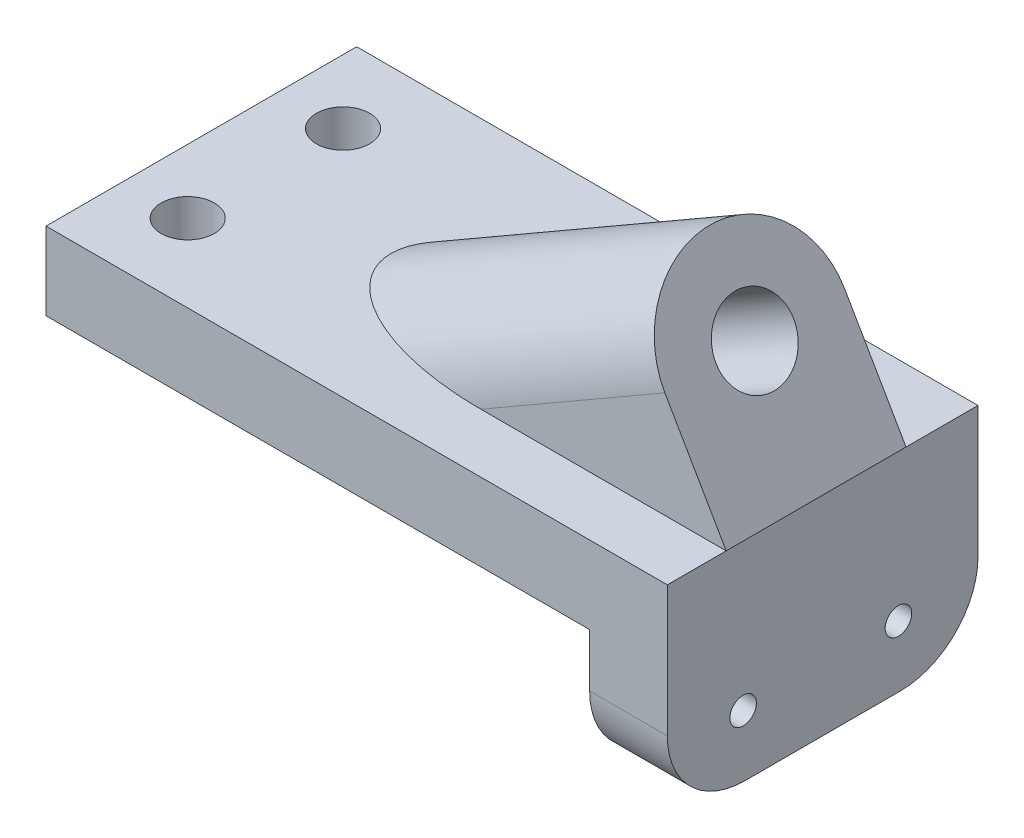
ISO-10303-21;
HEADER;
FILE_DESCRIPTION(('STEP AP214'),'2;1');
FILE_NAME('part.step','',(''),(''),'','','');
FILE_SCHEMA(('AUTOMOTIVE_DESIGN { 1 0 10303 214 1 1 1 1 }'));
ENDSEC;
DATA;
#1=APPLICATION_CONTEXT('core data for automotive mechanical design processes');
#2=APPLICATION_PROTOCOL_DEFINITION('international standard','automotive_design',2000,#1);
#3=PRODUCT_CONTEXT('',#1,'mechanical');
#4=PRODUCT('Part','Part','',(#3));
#5=PRODUCT_RELATED_PRODUCT_CATEGORY('part','',(#4));
#6=PRODUCT_DEFINITION_FORMATION('','',#4);
#7=PRODUCT_DEFINITION_CONTEXT('part definition',#1,'design');
#8=PRODUCT_DEFINITION('design','',#6,#7);
#9=PRODUCT_DEFINITION_SHAPE('','',#8);
#10=(LENGTH_UNIT() NAMED_UNIT(*) SI_UNIT(.MILLI.,.METRE.));
#11=(NAMED_UNIT(*) PLANE_ANGLE_UNIT() SI_UNIT($,.RADIAN.));
#12=(NAMED_UNIT(*) SI_UNIT($,.STERADIAN.) SOLID_ANGLE_UNIT());
#13=UNCERTAINTY_MEASURE_WITH_UNIT(LENGTH_MEASURE(1.E-05),#10,'distance_accuracy_value','');
#14=(GEOMETRIC_REPRESENTATION_CONTEXT(3) GLOBAL_UNCERTAINTY_ASSIGNED_CONTEXT((#13)) GLOBAL_UNIT_ASSIGNED_CONTEXT((#10,
#11,#12)) REPRESENTATION_CONTEXT('',''));
#15=CARTESIAN_POINT('',(0.,0.,0.));
#16=DIRECTION('',(0.,0.,1.));
#17=DIRECTION('',(1.,0.,0.));
#18=AXIS2_PLACEMENT_3D('',#15,#16,#17);
#19=CARTESIAN_POINT('',(0.,-19.,76.));
#20=DIRECTION('',(-1.,0.,0.));
#21=DIRECTION('',(0.,0.,1.));
#22=AXIS2_PLACEMENT_3D('',#19,#20,#21);
#23=PLANE('',#22);
#24=DIRECTION('',(0.,1.,0.));
#25=VECTOR('',#24,1.);
#26=CARTESIAN_POINT('',(0.,-19.,0.));
#27=LINE('',#26,#25);
#28=CARTESIAN_POINT('',(0.,-19.,0.));
#29=VERTEX_POINT('',#28);
#30=CARTESIAN_POINT('',(0.,0.,0.));
#31=VERTEX_POINT('',#30);
#32=EDGE_CURVE('E193',#29,#31,#27,.T.);
#33=ORIENTED_EDGE('',*,*,#32,.F.);
#34=DIRECTION('',(0.,0.,-1.));
#35=VECTOR('',#34,1.);
#36=CARTESIAN_POINT('',(0.,-19.,76.));
#37=LINE('',#36,#35);
#38=CARTESIAN_POINT('',(0.,-19.,76.));
#39=VERTEX_POINT('',#38);
#40=EDGE_CURVE('E172',#39,#29,#37,.T.);
#41=ORIENTED_EDGE('',*,*,#40,.F.);
#42=DIRECTION('',(0.,1.,0.));
#43=VECTOR('',#42,1.);
#44=CARTESIAN_POINT('',(0.,-19.,76.));
#45=LINE('',#44,#43);
#46=CARTESIAN_POINT('',(0.,0.,76.));
#47=VERTEX_POINT('',#46);
#48=EDGE_CURVE('E173',#39,#47,#45,.T.);
#49=ORIENTED_EDGE('',*,*,#48,.T.);
#50=DIRECTION('',(0.,0.,-1.));
#51=VECTOR('',#50,1.);
#52=CARTESIAN_POINT('',(0.,0.,76.));
#53=LINE('',#52,#51);
#54=EDGE_CURVE('E192',#47,#31,#53,.T.);
#55=ORIENTED_EDGE('',*,*,#54,.T.);
#56=EDGE_LOOP('',(#33,#41,#49,#55));
#57=FACE_BOUND('',#56,.T.);
#58=ADVANCED_FACE('F39',(#57),#23,.T.);
#59=CARTESIAN_POINT('',(133.,-19.,76.));
#60=DIRECTION('',(0.,-1.,0.));
#61=DIRECTION('',(1.,0.,0.));
#62=AXIS2_PLACEMENT_3D('',#59,#60,#61);
#63=PLANE('',#62);
#64=CARTESIAN_POINT('',(15.6653202113634,-19.,57.));
#65=DIRECTION('',(0.,-1.,0.));
#66=DIRECTION('',(1.,0.,0.));
#67=AXIS2_PLACEMENT_3D('',#64,#65,#66);
#68=CIRCLE('',#67,6.5);
#69=CARTESIAN_POINT('',(22.1653202113634,-19.,57.));
#70=VERTEX_POINT('',#69);
#71=EDGE_CURVE('E299',#70,#70,#68,.T.);
#72=ORIENTED_EDGE('',*,*,#71,.F.);
#73=EDGE_LOOP('',(#72));
#74=FACE_BOUND('',#73,.T.);
#75=CARTESIAN_POINT('',(15.6653202113634,-19.,19.));
#76=DIRECTION('',(0.,-1.,0.));
#77=DIRECTION('',(1.,0.,0.));
#78=AXIS2_PLACEMENT_3D('',#75,#76,#77);
#79=CIRCLE('',#78,6.5);
#80=CARTESIAN_POINT('',(22.1653202113634,-19.,19.));
#81=VERTEX_POINT('',#80);
#82=EDGE_CURVE('E306',#81,#81,#79,.T.);
#83=ORIENTED_EDGE('',*,*,#82,.F.);
#84=EDGE_LOOP('',(#83));
#85=FACE_BOUND('',#84,.T.);
#86=DIRECTION('',(-1.,0.,0.));
#87=VECTOR('',#86,1.);
#88=CARTESIAN_POINT('',(133.,-19.,0.));
#89=LINE('',#88,#87);
#90=CARTESIAN_POINT('',(133.,-19.,0.));
#91=VERTEX_POINT('',#90);
#92=EDGE_CURVE('E178',#91,#29,#89,.T.);
#93=ORIENTED_EDGE('',*,*,#92,.F.);
#94=DIRECTION('',(0.,0.,-1.));
#95=VECTOR('',#94,1.);
#96=CARTESIAN_POINT('',(133.,-19.,76.));
#97=LINE('',#96,#95);
#98=CARTESIAN_POINT('',(133.,-19.,76.));
#99=VERTEX_POINT('',#98);
#100=EDGE_CURVE('E213',#99,#91,#97,.T.);
#101=ORIENTED_EDGE('',*,*,#100,.F.);
#102=DIRECTION('',(-1.,0.,0.));
#103=VECTOR('',#102,1.);
#104=CARTESIAN_POINT('',(133.,-19.,76.));
#105=LINE('',#104,#103);
#106=EDGE_CURVE('E188',#99,#39,#105,.T.);
#107=ORIENTED_EDGE('',*,*,#106,.T.);
#108=ORIENTED_EDGE('',*,*,#40,.T.);
#109=EDGE_LOOP('',(#93,#101,#107,#108));
#110=FACE_BOUND('',#109,.T.);
#111=ADVANCED_FACE('F274',(#74,#85,#110),#63,.T.);
#112=CARTESIAN_POINT('',(133.,-51.,76.));
#113=DIRECTION('',(-1.,0.,0.));
#114=DIRECTION('',(0.,0.,1.));
#115=AXIS2_PLACEMENT_3D('',#112,#113,#114);
#116=PLANE('',#115);
#117=CARTESIAN_POINT('',(133.,-35.9135856078218,57.4589917201845));
#118=DIRECTION('',(-1.,0.,0.));
#119=DIRECTION('',(0.,0.,1.));
#120=AXIS2_PLACEMENT_3D('',#117,#118,#119);
#121=CIRCLE('',#120,3.25);
#122=CARTESIAN_POINT('',(133.,-35.9135856078218,60.7089917201845));
#123=VERTEX_POINT('',#122);
#124=EDGE_CURVE('E156',#123,#123,#121,.T.);
#125=ORIENTED_EDGE('',*,*,#124,.F.);
#126=EDGE_LOOP('',(#125));
#127=FACE_BOUND('',#126,.T.);
#128=CARTESIAN_POINT('',(133.,-35.9135856078218,19.4589917201845));
#129=DIRECTION('',(-1.,0.,0.));
#130=DIRECTION('',(0.,0.,1.));
#131=AXIS2_PLACEMENT_3D('',#128,#129,#130);
#132=CIRCLE('',#131,3.25);
#133=CARTESIAN_POINT('',(133.,-35.9135856078218,22.7089917201845));
#134=VERTEX_POINT('',#133);
#135=EDGE_CURVE('E290',#134,#134,#132,.T.);
#136=ORIENTED_EDGE('',*,*,#135,.F.);
#137=EDGE_LOOP('',(#136));
#138=FACE_BOUND('',#137,.T.);
#139=DIRECTION('',(0.,1.,0.));
#140=VECTOR('',#139,1.);
#141=CARTESIAN_POINT('',(133.,-51.,0.));
#142=LINE('',#141,#140);
#143=CARTESIAN_POINT('',(133.,-32.,0.));
#144=VERTEX_POINT('',#143);
#145=EDGE_CURVE('E205',#144,#91,#142,.T.);
#146=ORIENTED_EDGE('',*,*,#145,.F.);
#147=CARTESIAN_POINT('',(133.,-32.,19.));
#148=DIRECTION('',(-1.,0.,0.));
#149=DIRECTION('',(0.,0.,1.));
#150=AXIS2_PLACEMENT_3D('',#147,#148,#149);
#151=CIRCLE('',#150,19.);
#152=CARTESIAN_POINT('',(133.,-51.,19.));
#153=VERTEX_POINT('',#152);
#154=EDGE_CURVE('E236',#144,#153,#151,.T.);
#155=ORIENTED_EDGE('',*,*,#154,.T.);
#156=DIRECTION('',(0.,0.,-1.));
#157=VECTOR('',#156,1.);
#158=CARTESIAN_POINT('',(133.,-51.,76.));
#159=LINE('',#158,#157);
#160=CARTESIAN_POINT('',(133.,-51.,57.));
#161=VERTEX_POINT('',#160);
#162=EDGE_CURVE('E217',#161,#153,#159,.T.);
#163=ORIENTED_EDGE('',*,*,#162,.F.);
#164=CARTESIAN_POINT('',(133.,-32.,57.));
#165=DIRECTION('',(-1.,0.,0.));
#166=DIRECTION('',(0.,0.,1.));
#167=AXIS2_PLACEMENT_3D('',#164,#165,#166);
#168=CIRCLE('',#167,19.);
#169=CARTESIAN_POINT('',(133.,-32.,76.));
#170=VERTEX_POINT('',#169);
#171=EDGE_CURVE('E233',#161,#170,#168,.T.);
#172=ORIENTED_EDGE('',*,*,#171,.T.);
#173=DIRECTION('',(0.,1.,0.));
#174=VECTOR('',#173,1.);
#175=CARTESIAN_POINT('',(133.,-51.,76.));
#176=LINE('',#175,#174);
#177=EDGE_CURVE('E185',#170,#99,#176,.T.);
#178=ORIENTED_EDGE('',*,*,#177,.T.);
#179=ORIENTED_EDGE('',*,*,#100,.T.);
#180=EDGE_LOOP('',(#146,#155,#163,#172,#178,#179));
#181=FACE_BOUND('',#180,.T.);
#182=ADVANCED_FACE('F262',(#127,#138,#181),#116,.T.);
#183=CARTESIAN_POINT('',(152.,-51.,76.));
#184=DIRECTION('',(0.,-1.,0.));
#185=DIRECTION('',(1.,0.,0.));
#186=AXIS2_PLACEMENT_3D('',#183,#184,#185);
#187=PLANE('',#186);
#188=ORIENTED_EDGE('',*,*,#162,.T.);
#189=DIRECTION('',(-1.,0.,0.));
#190=VECTOR('',#189,1.);
#191=CARTESIAN_POINT('',(152.,-51.,19.));
#192=LINE('',#191,#190);
#193=CARTESIAN_POINT('',(152.,-51.,19.));
#194=VERTEX_POINT('',#193);
#195=EDGE_CURVE('E61',#153,#194,#192,.F.);
#196=ORIENTED_EDGE('',*,*,#195,.T.);
#197=DIRECTION('',(0.,0.,-1.));
#198=VECTOR('',#197,1.);
#199=CARTESIAN_POINT('',(152.,-51.,76.));
#200=LINE('',#199,#198);
#201=CARTESIAN_POINT('',(152.,-51.,57.));
#202=VERTEX_POINT('',#201);
#203=EDGE_CURVE('E220',#202,#194,#200,.T.);
#204=ORIENTED_EDGE('',*,*,#203,.F.);
#205=DIRECTION('',(-1.,0.,0.));
#206=VECTOR('',#205,1.);
#207=CARTESIAN_POINT('',(133.,-51.,57.));
#208=LINE('',#207,#206);
#209=EDGE_CURVE('E239',#202,#161,#208,.T.);
#210=ORIENTED_EDGE('',*,*,#209,.T.);
#211=EDGE_LOOP('',(#188,#196,#204,#210));
#212=FACE_BOUND('',#211,.T.);
#213=ADVANCED_FACE('F263',(#212),#187,.T.);
#214=CARTESIAN_POINT('',(152.,0.,76.));
#215=DIRECTION('',(1.,0.,0.));
#216=DIRECTION('',(0.,0.,-1.));
#217=AXIS2_PLACEMENT_3D('',#214,#215,#216);
#218=PLANE('',#217);
#219=CARTESIAN_POINT('',(152.,-35.9135856078218,57.4589917201845));
#220=DIRECTION('',(1.,0.,0.));
#221=DIRECTION('',(0.,0.,-1.));
#222=AXIS2_PLACEMENT_3D('',#219,#220,#221);
#223=CIRCLE('',#222,3.25);
#224=CARTESIAN_POINT('',(152.,-35.9135856078218,54.2089917201845));
#225=VERTEX_POINT('',#224);
#226=EDGE_CURVE('E294',#225,#225,#223,.T.);
#227=ORIENTED_EDGE('',*,*,#226,.F.);
#228=EDGE_LOOP('',(#227));
#229=FACE_BOUND('',#228,.T.);
#230=CARTESIAN_POINT('',(152.,-35.9135856078218,19.4589917201845));
#231=DIRECTION('',(1.,0.,0.));
#232=DIRECTION('',(0.,0.,-1.));
#233=AXIS2_PLACEMENT_3D('',#230,#231,#232);
#234=CIRCLE('',#233,3.25);
#235=CARTESIAN_POINT('',(152.,-35.9135856078218,16.2089917201845));
#236=VERTEX_POINT('',#235);
#237=EDGE_CURVE('E295',#236,#236,#234,.T.);
#238=ORIENTED_EDGE('',*,*,#237,.F.);
#239=EDGE_LOOP('',(#238));
#240=FACE_BOUND('',#239,.T.);
#241=ORIENTED_EDGE('',*,*,#203,.T.);
#242=CARTESIAN_POINT('',(152.,-32.,19.));
#243=DIRECTION('',(1.,0.,0.));
#244=DIRECTION('',(0.,0.,-1.));
#245=AXIS2_PLACEMENT_3D('',#242,#243,#244);
#246=CIRCLE('',#245,19.);
#247=CARTESIAN_POINT('',(152.,-32.,0.));
#248=VERTEX_POINT('',#247);
#249=EDGE_CURVE('E48',#194,#248,#246,.T.);
#250=ORIENTED_EDGE('',*,*,#249,.T.);
#251=DIRECTION('',(0.,-1.,0.));
#252=VECTOR('',#251,1.);
#253=CARTESIAN_POINT('',(152.,0.,0.));
#254=LINE('',#253,#252);
#255=CARTESIAN_POINT('',(152.,0.,0.));
#256=VERTEX_POINT('',#255);
#257=EDGE_CURVE('E201',#256,#248,#254,.T.);
#258=ORIENTED_EDGE('',*,*,#257,.F.);
#259=DIRECTION('',(0.,0.,-1.));
#260=VECTOR('',#259,1.);
#261=CARTESIAN_POINT('',(152.,0.,76.));
#262=LINE('',#261,#260);
#263=CARTESIAN_POINT('',(152.,0.,17.6043918931693));
#264=VERTEX_POINT('',#263);
#265=EDGE_CURVE('E227',#264,#256,#262,.T.);
#266=ORIENTED_EDGE('',*,*,#265,.F.);
#267=DIRECTION('',(0.,0.,-1.));
#268=VECTOR('',#267,1.);
#269=CARTESIAN_POINT('',(152.,0.,61.6043918931693));
#270=LINE('',#269,#268);
#271=CARTESIAN_POINT('',(152.,0.,61.6043918931693));
#272=VERTEX_POINT('',#271);
#273=EDGE_CURVE('E148',#272,#264,#270,.T.);
#274=ORIENTED_EDGE('',*,*,#273,.F.);
#275=CARTESIAN_POINT('',(152.,0.,76.));
#276=VERTEX_POINT('',#275);
#277=EDGE_CURVE('E223',#276,#272,#262,.T.);
#278=ORIENTED_EDGE('',*,*,#277,.F.);
#279=DIRECTION('',(0.,-1.,0.));
#280=VECTOR('',#279,1.);
#281=CARTESIAN_POINT('',(152.,0.,76.));
#282=LINE('',#281,#280);
#283=CARTESIAN_POINT('',(152.,-32.,76.));
#284=VERTEX_POINT('',#283);
#285=EDGE_CURVE('E182',#276,#284,#282,.T.);
#286=ORIENTED_EDGE('',*,*,#285,.T.);
#287=CARTESIAN_POINT('',(152.,-32.,57.));
#288=DIRECTION('',(1.,0.,0.));
#289=DIRECTION('',(0.,0.,-1.));
#290=AXIS2_PLACEMENT_3D('',#287,#288,#289);
#291=CIRCLE('',#290,19.);
#292=EDGE_CURVE('E245',#284,#202,#291,.T.);
#293=ORIENTED_EDGE('',*,*,#292,.T.);
#294=EDGE_LOOP('',(#241,#250,#258,#266,#274,#278,#286,#293));
#295=FACE_BOUND('',#294,.T.);
#296=ADVANCED_FACE('F251',(#229,#240,#295),#218,.T.);
#297=CARTESIAN_POINT('',(0.,0.,76.));
#298=DIRECTION('',(0.,1.,0.));
#299=DIRECTION('',(0.,0.,1.));
#300=AXIS2_PLACEMENT_3D('',#297,#298,#299);
#301=PLANE('',#300);
#302=CARTESIAN_POINT('',(15.6653202113634,0.,57.));
#303=DIRECTION('',(0.,1.,0.));
#304=DIRECTION('',(0.,0.,1.));
#305=AXIS2_PLACEMENT_3D('',#302,#303,#304);
#306=CIRCLE('',#305,6.5);
#307=CARTESIAN_POINT('',(15.6653202113634,0.,63.5));
#308=VERTEX_POINT('',#307);
#309=EDGE_CURVE('E310',#308,#308,#306,.T.);
#310=ORIENTED_EDGE('',*,*,#309,.F.);
#311=EDGE_LOOP('',(#310));
#312=FACE_BOUND('',#311,.T.);
#313=CARTESIAN_POINT('',(15.6653202113634,0.,19.));
#314=DIRECTION('',(0.,1.,0.));
#315=DIRECTION('',(0.,0.,1.));
#316=AXIS2_PLACEMENT_3D('',#313,#314,#315);
#317=CIRCLE('',#316,6.5);
#318=CARTESIAN_POINT('',(15.6653202113634,0.,25.5));
#319=VERTEX_POINT('',#318);
#320=EDGE_CURVE('E311',#319,#319,#317,.T.);
#321=ORIENTED_EDGE('',*,*,#320,.F.);
#322=EDGE_LOOP('',(#321));
#323=FACE_BOUND('',#322,.T.);
#324=CARTESIAN_POINT('',(91.9999999999998,0.,39.6043918931693));
#325=DIRECTION('',(0.,1.,0.));
#326=DIRECTION('',(1.,0.,0.));
#327=AXIS2_PLACEMENT_3D('',#324,#325,#326);
#328=ELLIPSE('',#327,44.0000000000002,22.);
#329=CARTESIAN_POINT('',(91.9999999999998,0.,61.6043918931693));
#330=VERTEX_POINT('',#329);
#331=CARTESIAN_POINT('',(91.9999999999998,0.,17.6043918931693));
#332=VERTEX_POINT('',#331);
#333=EDGE_CURVE('E133',#330,#332,#328,.F.);
#334=ORIENTED_EDGE('',*,*,#333,.T.);
#335=DIRECTION('',(1.,0.,0.));
#336=VECTOR('',#335,1.);
#337=CARTESIAN_POINT('',(9.51271277748372,0.,17.6043918931693));
#338=LINE('',#337,#336);
#339=EDGE_CURVE('E165',#332,#264,#338,.T.);
#340=ORIENTED_EDGE('',*,*,#339,.T.);
#341=ORIENTED_EDGE('',*,*,#265,.T.);
#342=DIRECTION('',(1.,0.,0.));
#343=VECTOR('',#342,1.);
#344=CARTESIAN_POINT('',(0.,0.,0.));
#345=LINE('',#344,#343);
#346=EDGE_CURVE('E197',#31,#256,#345,.T.);
#347=ORIENTED_EDGE('',*,*,#346,.F.);
#348=ORIENTED_EDGE('',*,*,#54,.F.);
#349=DIRECTION('',(1.,0.,0.));
#350=VECTOR('',#349,1.);
#351=CARTESIAN_POINT('',(0.,0.,76.));
#352=LINE('',#351,#350);
#353=EDGE_CURVE('E177',#47,#276,#352,.T.);
#354=ORIENTED_EDGE('',*,*,#353,.T.);
#355=ORIENTED_EDGE('',*,*,#277,.T.);
#356=DIRECTION('',(-1.,0.,0.));
#357=VECTOR('',#356,1.);
#358=CARTESIAN_POINT('',(9.51271277748372,0.,61.6043918931693));
#359=LINE('',#358,#357);
#360=EDGE_CURVE('E143',#272,#330,#359,.T.);
#361=ORIENTED_EDGE('',*,*,#360,.T.);
#362=EDGE_LOOP('',(#334,#340,#341,#347,#348,#354,#355,#361));
#363=FACE_BOUND('',#362,.T.);
#364=ADVANCED_FACE('F278',(#312,#323,#363),#301,.T.);
#365=CARTESIAN_POINT('',(0.,0.,76.));
#366=DIRECTION('',(0.,0.,-1.));
#367=DIRECTION('',(-1.,0.,0.));
#368=AXIS2_PLACEMENT_3D('',#365,#366,#367);
#369=PLANE('',#368);
#370=ORIENTED_EDGE('',*,*,#177,.F.);
#371=DIRECTION('',(-1.,0.,0.));
#372=VECTOR('',#371,1.);
#373=CARTESIAN_POINT('',(152.,-32.,76.));
#374=LINE('',#373,#372);
#375=EDGE_CURVE('E11',#170,#284,#374,.F.);
#376=ORIENTED_EDGE('',*,*,#375,.T.);
#377=ORIENTED_EDGE('',*,*,#285,.F.);
#378=ORIENTED_EDGE('',*,*,#353,.F.);
#379=ORIENTED_EDGE('',*,*,#48,.F.);
#380=ORIENTED_EDGE('',*,*,#106,.F.);
#381=EDGE_LOOP('',(#370,#376,#377,#378,#379,#380));
#382=FACE_BOUND('',#381,.T.);
#383=ADVANCED_FACE('F269',(#382),#369,.F.);
#384=CARTESIAN_POINT('',(0.,0.,0.));
#385=DIRECTION('',(0.,0.,-1.));
#386=DIRECTION('',(-1.,0.,0.));
#387=AXIS2_PLACEMENT_3D('',#384,#385,#386);
#388=PLANE('',#387);
#389=ORIENTED_EDGE('',*,*,#257,.T.);
#390=DIRECTION('',(-1.,0.,0.));
#391=VECTOR('',#390,1.);
#392=CARTESIAN_POINT('',(0.,-31.9999999999999,0.));
#393=LINE('',#392,#391);
#394=EDGE_CURVE('E171',#248,#144,#393,.T.);
#395=ORIENTED_EDGE('',*,*,#394,.T.);
#396=ORIENTED_EDGE('',*,*,#145,.T.);
#397=ORIENTED_EDGE('',*,*,#92,.T.);
#398=ORIENTED_EDGE('',*,*,#32,.T.);
#399=ORIENTED_EDGE('',*,*,#346,.T.);
#400=EDGE_LOOP('',(#389,#395,#396,#397,#398,#399));
#401=FACE_BOUND('',#400,.T.);
#402=ADVANCED_FACE('F256',(#401),#388,.T.);
#403=CARTESIAN_POINT('',(9.51271277748372,-47.6240574826414,39.6043918931693));
#404=DIRECTION('',(0.86602540378444,0.499999999999998,0.));
#405=DIRECTION('',(-0.499999999999998,0.86602540378444,0.));
#406=AXIS2_PLACEMENT_3D('',#403,#404,#405);
#407=CYLINDRICAL_SURFACE('',#406,9.5);
#408=CARTESIAN_POINT('',(91.9999999999998,0.,39.6043918931693));
#409=DIRECTION('',(0.,1.,0.));
#410=DIRECTION('',(1.,0.,0.));
#411=AXIS2_PLACEMENT_3D('',#408,#409,#410);
#412=ELLIPSE('',#411,19.0000000000001,9.5);
#413=CARTESIAN_POINT('',(111.,0.,39.6043918931693));
#414=VERTEX_POINT('',#413);
#415=EDGE_CURVE('E167',#414,#414,#412,.F.);
#416=ORIENTED_EDGE('',*,*,#415,.T.);
#417=EDGE_LOOP('',(#416));
#418=FACE_BOUND('',#417,.T.);
#419=CARTESIAN_POINT('',(137.,25.9807621135332,39.6043918931693));
#420=DIRECTION('',(0.86602540378444,0.499999999999998,0.));
#421=DIRECTION('',(-0.499999999999998,0.86602540378444,0.));
#422=AXIS2_PLACEMENT_3D('',#419,#420,#421);
#423=CIRCLE('',#422,9.5);
#424=CARTESIAN_POINT('',(132.25,34.2080034494854,39.6043918931693));
#425=VERTEX_POINT('',#424);
#426=EDGE_CURVE('E152',#425,#425,#423,.T.);
#427=ORIENTED_EDGE('',*,*,#426,.T.);
#428=EDGE_LOOP('',(#427));
#429=FACE_BOUND('',#428,.T.);
#430=ADVANCED_FACE('F369',(#418,#429),#407,.F.);
#431=CARTESIAN_POINT('',(137.,25.9807621135332,39.6043918931693));
#432=DIRECTION('',(0.86602540378444,0.499999999999998,0.));
#433=DIRECTION('',(-0.499999999999998,0.86602540378444,0.));
#434=AXIS2_PLACEMENT_3D('',#431,#432,#433);
#435=PLANE('',#434);
#436=ORIENTED_EDGE('',*,*,#426,.F.);
#437=EDGE_LOOP('',(#436));
#438=FACE_BOUND('',#437,.T.);
#439=CARTESIAN_POINT('',(137.,25.9807621135332,39.6043918931693));
#440=DIRECTION('',(0.86602540378444,0.499999999999998,0.));
#441=DIRECTION('',(-0.499999999999998,0.86602540378444,0.));
#442=AXIS2_PLACEMENT_3D('',#439,#440,#441);
#443=CIRCLE('',#442,22.);
#444=CARTESIAN_POINT('',(137.,25.9807621135332,17.6043918931693));
#445=VERTEX_POINT('',#444);
#446=CARTESIAN_POINT('',(137.,25.9807621135332,61.6043918931693));
#447=VERTEX_POINT('',#446);
#448=EDGE_CURVE('E130',#445,#447,#443,.T.);
#449=ORIENTED_EDGE('',*,*,#448,.T.);
#450=DIRECTION('',(0.499999999999998,-0.86602540378444,0.));
#451=VECTOR('',#450,1.);
#452=CARTESIAN_POINT('',(137.,25.9807621135332,61.6043918931693));
#453=LINE('',#452,#451);
#454=EDGE_CURVE('E141',#447,#272,#453,.T.);
#455=ORIENTED_EDGE('',*,*,#454,.T.);
#456=ORIENTED_EDGE('',*,*,#273,.T.);
#457=DIRECTION('',(-0.499999999999998,0.86602540378444,0.));
#458=VECTOR('',#457,1.);
#459=CARTESIAN_POINT('',(137.,25.9807621135332,17.6043918931693));
#460=LINE('',#459,#458);
#461=EDGE_CURVE('E138',#264,#445,#460,.T.);
#462=ORIENTED_EDGE('',*,*,#461,.T.);
#463=EDGE_LOOP('',(#449,#455,#456,#462));
#464=FACE_BOUND('',#463,.T.);
#465=ADVANCED_FACE('F150',(#438,#464),#435,.T.);
#466=CARTESIAN_POINT('',(9.51271277748372,-47.6240574826414,61.6043918931693));
#467=DIRECTION('',(0.,0.,1.));
#468=DIRECTION('',(1.,0.,0.));
#469=AXIS2_PLACEMENT_3D('',#466,#467,#468);
#470=PLANE('',#469);
#471=ORIENTED_EDGE('',*,*,#360,.F.);
#472=ORIENTED_EDGE('',*,*,#454,.F.);
#473=DIRECTION('',(0.86602540378444,0.499999999999998,0.));
#474=VECTOR('',#473,1.);
#475=CARTESIAN_POINT('',(9.51271277748372,-47.6240574826414,61.6043918931693));
#476=LINE('',#475,#474);
#477=EDGE_CURVE('E125',#330,#447,#476,.T.);
#478=ORIENTED_EDGE('',*,*,#477,.F.);
#479=EDGE_LOOP('',(#471,#472,#478));
#480=FACE_BOUND('',#479,.T.);
#481=ADVANCED_FACE('F142',(#480),#470,.T.);
#482=CARTESIAN_POINT('',(9.51271277748372,-47.6240574826414,17.6043918931693));
#483=DIRECTION('',(0.,0.,-1.));
#484=DIRECTION('',(-1.,0.,0.));
#485=AXIS2_PLACEMENT_3D('',#482,#483,#484);
#486=PLANE('',#485);
#487=ORIENTED_EDGE('',*,*,#339,.F.);
#488=DIRECTION('',(0.86602540378444,0.499999999999998,0.));
#489=VECTOR('',#488,1.);
#490=CARTESIAN_POINT('',(9.51271277748372,-47.6240574826414,17.6043918931693));
#491=LINE('',#490,#489);
#492=EDGE_CURVE('E137',#332,#445,#491,.T.);
#493=ORIENTED_EDGE('',*,*,#492,.T.);
#494=ORIENTED_EDGE('',*,*,#461,.F.);
#495=EDGE_LOOP('',(#487,#493,#494));
#496=FACE_BOUND('',#495,.T.);
#497=ADVANCED_FACE('F458',(#496),#486,.T.);
#498=CARTESIAN_POINT('',(9.51271277748372,-47.6240574826414,39.6043918931693));
#499=DIRECTION('',(0.86602540378444,0.499999999999998,0.));
#500=DIRECTION('',(-0.499999999999998,0.86602540378444,0.));
#501=AXIS2_PLACEMENT_3D('',#498,#499,#500);
#502=CYLINDRICAL_SURFACE('',#501,22.);
#503=ORIENTED_EDGE('',*,*,#333,.F.);
#504=ORIENTED_EDGE('',*,*,#477,.T.);
#505=ORIENTED_EDGE('',*,*,#448,.F.);
#506=ORIENTED_EDGE('',*,*,#492,.F.);
#507=EDGE_LOOP('',(#503,#504,#505,#506));
#508=FACE_BOUND('',#507,.T.);
#509=ADVANCED_FACE('F127',(#508),#502,.T.);
#510=ORIENTED_EDGE('',*,*,#415,.F.);
#511=EDGE_LOOP('',(#510));
#512=FACE_BOUND('',#511,.T.);
#513=ADVANCED_FACE('F324',(#512),#301,.T.);
#514=CARTESIAN_POINT('',(76.,-35.9135856078218,19.4589917201845));
#515=DIRECTION('',(1.,0.,0.));
#516=DIRECTION('',(0.,0.,-1.));
#517=AXIS2_PLACEMENT_3D('',#514,#515,#516);
#518=CYLINDRICAL_SURFACE('',#517,3.25);
#519=ORIENTED_EDGE('',*,*,#135,.T.);
#520=EDGE_LOOP('',(#519));
#521=FACE_BOUND('',#520,.T.);
#522=ORIENTED_EDGE('',*,*,#237,.T.);
#523=EDGE_LOOP('',(#522));
#524=FACE_BOUND('',#523,.T.);
#525=ADVANCED_FACE('F338',(#521,#524),#518,.F.);
#526=CARTESIAN_POINT('',(76.,-35.9135856078218,57.4589917201845));
#527=DIRECTION('',(1.,0.,0.));
#528=DIRECTION('',(0.,0.,-1.));
#529=AXIS2_PLACEMENT_3D('',#526,#527,#528);
#530=CYLINDRICAL_SURFACE('',#529,3.25);
#531=ORIENTED_EDGE('',*,*,#124,.T.);
#532=EDGE_LOOP('',(#531));
#533=FACE_BOUND('',#532,.T.);
#534=ORIENTED_EDGE('',*,*,#226,.T.);
#535=EDGE_LOOP('',(#534));
#536=FACE_BOUND('',#535,.T.);
#537=ADVANCED_FACE('F329',(#533,#536),#530,.F.);
#538=CARTESIAN_POINT('',(15.6653202113634,-76.,19.));
#539=DIRECTION('',(0.,1.,0.));
#540=DIRECTION('',(0.,0.,1.));
#541=AXIS2_PLACEMENT_3D('',#538,#539,#540);
#542=CYLINDRICAL_SURFACE('',#541,6.5);
#543=ORIENTED_EDGE('',*,*,#82,.T.);
#544=EDGE_LOOP('',(#543));
#545=FACE_BOUND('',#544,.T.);
#546=ORIENTED_EDGE('',*,*,#320,.T.);
#547=EDGE_LOOP('',(#546));
#548=FACE_BOUND('',#547,.T.);
#549=ADVANCED_FACE('F327',(#545,#548),#542,.F.);
#550=CARTESIAN_POINT('',(15.6653202113634,-76.,57.));
#551=DIRECTION('',(0.,1.,0.));
#552=DIRECTION('',(0.,0.,1.));
#553=AXIS2_PLACEMENT_3D('',#550,#551,#552);
#554=CYLINDRICAL_SURFACE('',#553,6.5);
#555=ORIENTED_EDGE('',*,*,#71,.T.);
#556=EDGE_LOOP('',(#555));
#557=FACE_BOUND('',#556,.T.);
#558=ORIENTED_EDGE('',*,*,#309,.T.);
#559=EDGE_LOOP('',(#558));
#560=FACE_BOUND('',#559,.T.);
#561=ADVANCED_FACE('F319',(#557,#560),#554,.F.);
#562=CARTESIAN_POINT('',(0.,-31.9999999999999,19.));
#563=DIRECTION('',(-1.,0.,0.));
#564=DIRECTION('',(0.,-1.,0.));
#565=AXIS2_PLACEMENT_3D('',#562,#563,#564);
#566=CYLINDRICAL_SURFACE('',#565,19.);
#567=ORIENTED_EDGE('',*,*,#249,.F.);
#568=ORIENTED_EDGE('',*,*,#195,.F.);
#569=ORIENTED_EDGE('',*,*,#154,.F.);
#570=ORIENTED_EDGE('',*,*,#394,.F.);
#571=EDGE_LOOP('',(#567,#568,#569,#570));
#572=FACE_BOUND('',#571,.T.);
#573=ADVANCED_FACE('F259',(#572),#566,.T.);
#574=CARTESIAN_POINT('',(152.,-32.,57.));
#575=DIRECTION('',(1.,0.,0.));
#576=DIRECTION('',(0.,1.,0.));
#577=AXIS2_PLACEMENT_3D('',#574,#575,#576);
#578=CYLINDRICAL_SURFACE('',#577,19.);
#579=ORIENTED_EDGE('',*,*,#292,.F.);
#580=ORIENTED_EDGE('',*,*,#375,.F.);
#581=ORIENTED_EDGE('',*,*,#171,.F.);
#582=ORIENTED_EDGE('',*,*,#209,.F.);
#583=EDGE_LOOP('',(#579,#580,#581,#582));
#584=FACE_BOUND('',#583,.T.);
#585=ADVANCED_FACE('F41',(#584),#578,.T.);
#586=CLOSED_SHELL('',(#58,#111,#182,#213,#296,#364,#383,#402,#430,#465,#481,#497,#509,#513,#525,
#537,#549,#561,#573,#585));
#587=MANIFOLD_SOLID_BREP('B2',#586);
#588=ADVANCED_BREP_SHAPE_REPRESENTATION('',(#18,#587),#14);
#589=SHAPE_DEFINITION_REPRESENTATION(#9,#588);
ENDSEC;
END-ISO-10303-21;
